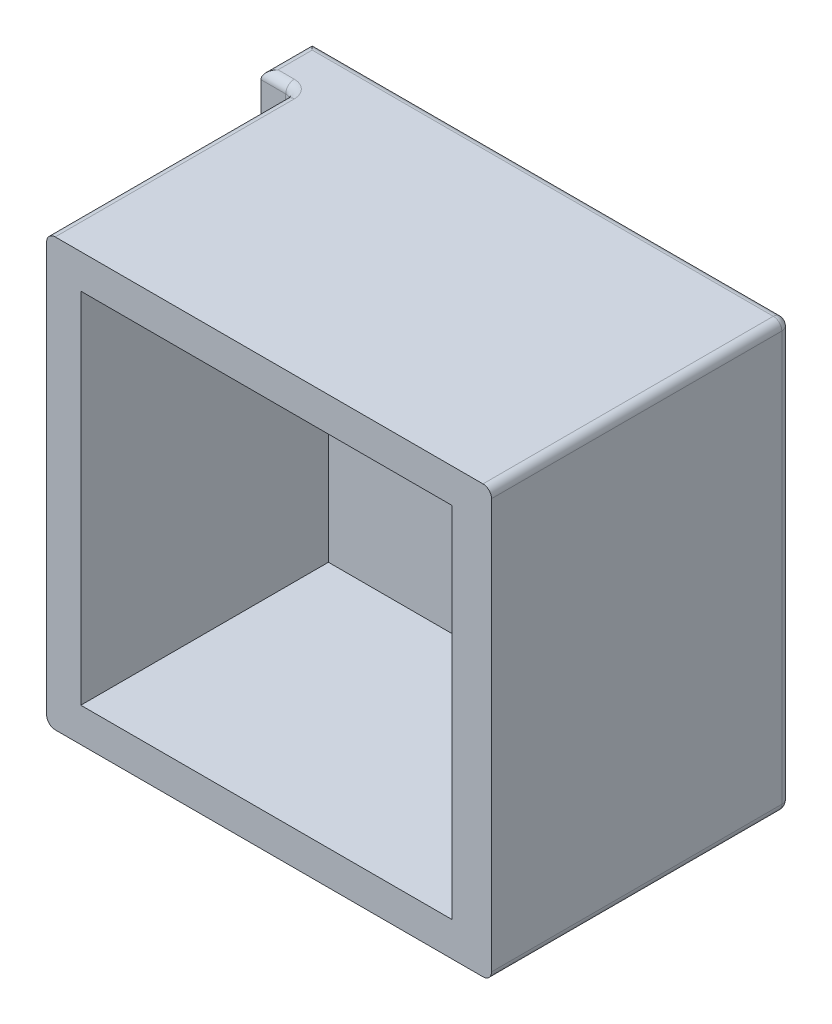
ISO-10303-21;
HEADER;
FILE_DESCRIPTION(('STEP AP214'),'2;1');
FILE_NAME('part.step','',(''),(''),'','','');
FILE_SCHEMA(('AUTOMOTIVE_DESIGN { 1 0 10303 214 1 1 1 1 }'));
ENDSEC;
DATA;
#1=APPLICATION_CONTEXT('core data for automotive mechanical design processes');
#2=APPLICATION_PROTOCOL_DEFINITION('international standard','automotive_design',2000,#1);
#3=PRODUCT_CONTEXT('',#1,'mechanical');
#4=PRODUCT('Part','Part','',(#3));
#5=PRODUCT_RELATED_PRODUCT_CATEGORY('part','',(#4));
#6=PRODUCT_DEFINITION_FORMATION('','',#4);
#7=PRODUCT_DEFINITION_CONTEXT('part definition',#1,'design');
#8=PRODUCT_DEFINITION('design','',#6,#7);
#9=PRODUCT_DEFINITION_SHAPE('','',#8);
#10=(LENGTH_UNIT() NAMED_UNIT(*) SI_UNIT(.MILLI.,.METRE.));
#11=(NAMED_UNIT(*) PLANE_ANGLE_UNIT() SI_UNIT($,.RADIAN.));
#12=(NAMED_UNIT(*) SI_UNIT($,.STERADIAN.) SOLID_ANGLE_UNIT());
#13=UNCERTAINTY_MEASURE_WITH_UNIT(LENGTH_MEASURE(1.E-05),#10,'distance_accuracy_value','');
#14=(GEOMETRIC_REPRESENTATION_CONTEXT(3) GLOBAL_UNCERTAINTY_ASSIGNED_CONTEXT((#13)) GLOBAL_UNIT_ASSIGNED_CONTEXT((#10,
#11,#12)) REPRESENTATION_CONTEXT('',''));
#15=CARTESIAN_POINT('',(0.,0.,0.));
#16=DIRECTION('',(0.,0.,1.));
#17=DIRECTION('',(1.,0.,0.));
#18=AXIS2_PLACEMENT_3D('',#15,#16,#17);
#19=CARTESIAN_POINT('',(0.,0.,6.));
#20=DIRECTION('',(0.,0.,1.));
#21=DIRECTION('',(1.,0.,0.));
#22=AXIS2_PLACEMENT_3D('',#19,#20,#21);
#23=PLANE('',#22);
#24=CARTESIAN_POINT('',(5.49163284391657,-11.0968858131488,6.));
#25=DIRECTION('',(0.,0.,1.));
#26=DIRECTION('',(1.,0.,0.));
#27=AXIS2_PLACEMENT_3D('',#24,#25,#26);
#28=CIRCLE('',#27,5.);
#29=CARTESIAN_POINT('',(10.4916328439166,-11.0968858131488,6.));
#30=VERTEX_POINT('',#29);
#31=EDGE_CURVE('E245',#30,#30,#28,.T.);
#32=ORIENTED_EDGE('',*,*,#31,.F.);
#33=EDGE_LOOP('',(#32));
#34=FACE_BOUND('',#33,.T.);
#35=DIRECTION('',(0.,1.,0.));
#36=VECTOR('',#35,1.);
#37=CARTESIAN_POINT('',(27.6816328439166,9.90311418685121,6.));
#38=LINE('',#37,#36);
#39=CARTESIAN_POINT('',(27.6816328439166,-32.0968858131488,6.));
#40=VERTEX_POINT('',#39);
#41=CARTESIAN_POINT('',(27.6816328439166,9.90311418685121,6.));
#42=VERTEX_POINT('',#41);
#43=EDGE_CURVE('E214',#40,#42,#38,.T.);
#44=ORIENTED_EDGE('',*,*,#43,.T.);
#45=DIRECTION('',(-1.,0.,0.));
#46=VECTOR('',#45,1.);
#47=CARTESIAN_POINT('',(-15.8183671560834,9.90311418685121,6.));
#48=LINE('',#47,#46);
#49=CARTESIAN_POINT('',(-15.8183671560834,9.90311418685121,6.));
#50=VERTEX_POINT('',#49);
#51=EDGE_CURVE('E186',#42,#50,#48,.T.);
#52=ORIENTED_EDGE('',*,*,#51,.T.);
#53=DIRECTION('',(0.,-1.,0.));
#54=VECTOR('',#53,1.);
#55=CARTESIAN_POINT('',(-15.8183671560834,9.90311418685121,6.));
#56=LINE('',#55,#54);
#57=CARTESIAN_POINT('',(-15.8183671560834,-32.0968858131488,6.));
#58=VERTEX_POINT('',#57);
#59=EDGE_CURVE('E209',#50,#58,#56,.T.);
#60=ORIENTED_EDGE('',*,*,#59,.T.);
#61=DIRECTION('',(1.,0.,0.));
#62=VECTOR('',#61,1.);
#63=CARTESIAN_POINT('',(-15.8183671560834,-32.0968858131488,6.));
#64=LINE('',#63,#62);
#65=EDGE_CURVE('E192',#58,#40,#64,.T.);
#66=ORIENTED_EDGE('',*,*,#65,.T.);
#67=EDGE_LOOP('',(#44,#52,#60,#66));
#68=FACE_BOUND('',#67,.T.);
#69=ADVANCED_FACE('F41',(#34,#68),#23,.T.);
#70=DIRECTION('',(0.,-1.,0.));
#71=VECTOR('',#70,1.);
#72=CARTESIAN_POINT('',(-20.8183671560834,0.,6.));
#73=LINE('',#72,#71);
#74=CARTESIAN_POINT('',(-20.8183671560834,-35.0968858131488,6.));
#75=VERTEX_POINT('',#74);
#76=CARTESIAN_POINT('',(-20.8183671560834,12.9031141868512,6.));
#77=VERTEX_POINT('',#76);
#78=EDGE_CURVE('E257',#75,#77,#73,.F.);
#79=ORIENTED_EDGE('',*,*,#78,.T.);
#80=DIRECTION('',(-1.,0.,0.));
#81=VECTOR('',#80,1.);
#82=CARTESIAN_POINT('',(-23.7183671560834,12.9031141868512,6.));
#83=LINE('',#82,#81);
#84=CARTESIAN_POINT('',(-23.7183671560834,12.9031141868512,6.));
#85=VERTEX_POINT('',#84);
#86=EDGE_CURVE('E266',#77,#85,#83,.T.);
#87=ORIENTED_EDGE('',*,*,#86,.T.);
#88=DIRECTION('',(0.,-1.,0.));
#89=VECTOR('',#88,1.);
#90=CARTESIAN_POINT('',(-23.7183671560834,13.9031141868512,6.));
#91=LINE('',#90,#89);
#92=CARTESIAN_POINT('',(-23.7183671560834,-35.0968858131488,6.));
#93=VERTEX_POINT('',#92);
#94=EDGE_CURVE('E253',#85,#93,#91,.T.);
#95=ORIENTED_EDGE('',*,*,#94,.T.);
#96=DIRECTION('',(1.,0.,0.));
#97=VECTOR('',#96,1.);
#98=CARTESIAN_POINT('',(-19.8183671560834,-35.0968858131488,6.));
#99=LINE('',#98,#97);
#100=EDGE_CURVE('E263',#93,#75,#99,.T.);
#101=ORIENTED_EDGE('',*,*,#100,.T.);
#102=EDGE_LOOP('',(#79,#87,#95,#101));
#103=FACE_BOUND('',#102,.T.);
#104=ADVANCED_FACE('F483',(#103),#23,.T.);
#105=CARTESIAN_POINT('',(0.,0.,0.));
#106=DIRECTION('',(0.,0.,1.));
#107=DIRECTION('',(1.,0.,0.));
#108=AXIS2_PLACEMENT_3D('',#105,#106,#107);
#109=PLANE('',#108);
#110=DIRECTION('',(0.,1.,0.));
#111=VECTOR('',#110,1.);
#112=CARTESIAN_POINT('',(31.2816328439166,0.,0.));
#113=LINE('',#112,#111);
#114=CARTESIAN_POINT('',(31.2816328439166,12.9031141868512,0.));
#115=VERTEX_POINT('',#114);
#116=CARTESIAN_POINT('',(31.2816328439166,-35.0968858131488,0.));
#117=VERTEX_POINT('',#116);
#118=EDGE_CURVE('E309',#115,#117,#113,.F.);
#119=ORIENTED_EDGE('',*,*,#118,.T.);
#120=DIRECTION('',(1.,0.,0.));
#121=VECTOR('',#120,1.);
#122=CARTESIAN_POINT('',(0.,-35.0968858131488,0.));
#123=LINE('',#122,#121);
#124=CARTESIAN_POINT('',(-23.7183671560834,-35.0968858131488,0.));
#125=VERTEX_POINT('',#124);
#126=EDGE_CURVE('E315',#117,#125,#123,.F.);
#127=ORIENTED_EDGE('',*,*,#126,.T.);
#128=DIRECTION('',(0.,-1.,0.));
#129=VECTOR('',#128,1.);
#130=CARTESIAN_POINT('',(-23.7183671560834,13.9031141868512,0.));
#131=LINE('',#130,#129);
#132=CARTESIAN_POINT('',(-23.7183671560834,12.9031141868512,0.));
#133=VERTEX_POINT('',#132);
#134=EDGE_CURVE('E249',#133,#125,#131,.T.);
#135=ORIENTED_EDGE('',*,*,#134,.F.);
#136=DIRECTION('',(-1.,0.,0.));
#137=VECTOR('',#136,1.);
#138=CARTESIAN_POINT('',(0.,12.9031141868512,0.));
#139=LINE('',#138,#137);
#140=EDGE_CURVE('E312',#133,#115,#139,.F.);
#141=ORIENTED_EDGE('',*,*,#140,.T.);
#142=EDGE_LOOP('',(#119,#127,#135,#141));
#143=FACE_BOUND('',#142,.T.);
#144=CARTESIAN_POINT('',(5.49163284391657,-11.0968858131488,0.));
#145=DIRECTION('',(0.,0.,1.));
#146=DIRECTION('',(1.,0.,0.));
#147=AXIS2_PLACEMENT_3D('',#144,#145,#146);
#148=CIRCLE('',#147,5.);
#149=CARTESIAN_POINT('',(10.4916328439166,-11.0968858131488,0.));
#150=VERTEX_POINT('',#149);
#151=EDGE_CURVE('E244',#150,#150,#148,.T.);
#152=ORIENTED_EDGE('',*,*,#151,.T.);
#153=EDGE_LOOP('',(#152));
#154=FACE_BOUND('',#153,.T.);
#155=ADVANCED_FACE('F490',(#143,#154),#109,.F.);
#156=CARTESIAN_POINT('',(-23.7183671560834,13.9031141868512,6.));
#157=DIRECTION('',(1.,0.,0.));
#158=DIRECTION('',(0.,1.,0.));
#159=AXIS2_PLACEMENT_3D('',#156,#157,#158);
#160=PLANE('',#159);
#161=ORIENTED_EDGE('',*,*,#134,.T.);
#162=DIRECTION('',(0.,0.,-1.));
#163=VECTOR('',#162,1.);
#164=CARTESIAN_POINT('',(-23.7183671560834,-35.0968858131488,6.));
#165=LINE('',#164,#163);
#166=EDGE_CURVE('E330',#125,#93,#165,.F.);
#167=ORIENTED_EDGE('',*,*,#166,.T.);
#168=ORIENTED_EDGE('',*,*,#94,.F.);
#169=DIRECTION('',(0.,0.,-1.));
#170=VECTOR('',#169,1.);
#171=CARTESIAN_POINT('',(-23.7183671560834,12.9031141868512,6.));
#172=LINE('',#171,#170);
#173=EDGE_CURVE('E327',#85,#133,#172,.T.);
#174=ORIENTED_EDGE('',*,*,#173,.T.);
#175=EDGE_LOOP('',(#161,#167,#168,#174));
#176=FACE_BOUND('',#175,.T.);
#177=ADVANCED_FACE('F486',(#176),#160,.F.);
#178=CARTESIAN_POINT('',(-23.7183671560834,-36.0968858131488,6.));
#179=DIRECTION('',(0.,1.,0.));
#180=DIRECTION('',(0.,0.,1.));
#181=AXIS2_PLACEMENT_3D('',#178,#179,#180);
#182=PLANE('',#181);
#183=DIRECTION('',(1.,0.,0.));
#184=VECTOR('',#183,1.);
#185=CARTESIAN_POINT('',(32.2816328439166,-36.0968858131488,35.));
#186=LINE('',#185,#184);
#187=CARTESIAN_POINT('',(-18.8183671560834,-36.0968858131488,35.));
#188=VERTEX_POINT('',#187);
#189=CARTESIAN_POINT('',(31.2816328439166,-36.0968858131488,35.));
#190=VERTEX_POINT('',#189);
#191=EDGE_CURVE('E236',#188,#190,#186,.T.);
#192=ORIENTED_EDGE('',*,*,#191,.F.);
#193=DIRECTION('',(0.,0.,-1.));
#194=VECTOR('',#193,1.);
#195=CARTESIAN_POINT('',(-18.8183671560834,-36.0968858131488,6.));
#196=LINE('',#195,#194);
#197=CARTESIAN_POINT('',(-18.8183671560834,-36.0968858131488,7.));
#198=VERTEX_POINT('',#197);
#199=EDGE_CURVE('E306',#188,#198,#196,.T.);
#200=ORIENTED_EDGE('',*,*,#199,.T.);
#201=CARTESIAN_POINT('',(-20.8183671560834,-36.0968858131488,7.));
#202=DIRECTION('',(0.,1.,0.));
#203=DIRECTION('',(0.,0.,1.));
#204=AXIS2_PLACEMENT_3D('',#201,#202,#203);
#205=CIRCLE('',#204,2.);
#206=CARTESIAN_POINT('',(-20.8183671560834,-36.0968858131488,5.));
#207=VERTEX_POINT('',#206);
#208=EDGE_CURVE('E302',#207,#198,#205,.F.);
#209=ORIENTED_EDGE('',*,*,#208,.F.);
#210=DIRECTION('',(1.,0.,0.));
#211=VECTOR('',#210,1.);
#212=CARTESIAN_POINT('',(-23.7183671560834,-36.0968858131488,5.));
#213=LINE('',#212,#211);
#214=CARTESIAN_POINT('',(-22.7183671560834,-36.0968858131488,5.));
#215=VERTEX_POINT('',#214);
#216=EDGE_CURVE('E299',#207,#215,#213,.F.);
#217=ORIENTED_EDGE('',*,*,#216,.T.);
#218=DIRECTION('',(0.,0.,-1.));
#219=VECTOR('',#218,1.);
#220=CARTESIAN_POINT('',(-22.7183671560834,-36.0968858131488,6.));
#221=LINE('',#220,#219);
#222=CARTESIAN_POINT('',(-22.7183671560834,-36.0968858131488,1.));
#223=VERTEX_POINT('',#222);
#224=EDGE_CURVE('E296',#215,#223,#221,.T.);
#225=ORIENTED_EDGE('',*,*,#224,.T.);
#226=DIRECTION('',(1.,0.,0.));
#227=VECTOR('',#226,1.);
#228=CARTESIAN_POINT('',(-23.7183671560834,-36.0968858131488,1.));
#229=LINE('',#228,#227);
#230=CARTESIAN_POINT('',(31.2816328439166,-36.0968858131488,1.));
#231=VERTEX_POINT('',#230);
#232=EDGE_CURVE('E293',#223,#231,#229,.T.);
#233=ORIENTED_EDGE('',*,*,#232,.T.);
#234=DIRECTION('',(0.,0.,-1.));
#235=VECTOR('',#234,1.);
#236=CARTESIAN_POINT('',(31.2816328439166,-36.0968858131488,6.));
#237=LINE('',#236,#235);
#238=EDGE_CURVE('E290',#231,#190,#237,.F.);
#239=ORIENTED_EDGE('',*,*,#238,.T.);
#240=EDGE_LOOP('',(#192,#200,#209,#217,#225,#233,#239));
#241=FACE_BOUND('',#240,.T.);
#242=ADVANCED_FACE('F421',(#241),#182,.F.);
#243=CARTESIAN_POINT('',(32.2816328439166,13.9031141868512,6.));
#244=DIRECTION('',(-1.,0.,0.));
#245=DIRECTION('',(0.,-1.,0.));
#246=AXIS2_PLACEMENT_3D('',#243,#244,#245);
#247=PLANE('',#246);
#248=DIRECTION('',(0.,1.,0.));
#249=VECTOR('',#248,1.);
#250=CARTESIAN_POINT('',(32.2816328439166,13.9031141868512,35.));
#251=LINE('',#250,#249);
#252=CARTESIAN_POINT('',(32.2816328439166,-35.0968858131488,35.));
#253=VERTEX_POINT('',#252);
#254=CARTESIAN_POINT('',(32.2816328439166,12.9031141868512,35.));
#255=VERTEX_POINT('',#254);
#256=EDGE_CURVE('E240',#253,#255,#251,.T.);
#257=ORIENTED_EDGE('',*,*,#256,.F.);
#258=DIRECTION('',(0.,0.,-1.));
#259=VECTOR('',#258,1.);
#260=CARTESIAN_POINT('',(32.2816328439166,-35.0968858131488,6.));
#261=LINE('',#260,#259);
#262=CARTESIAN_POINT('',(32.2816328439166,-35.0968858131488,1.));
#263=VERTEX_POINT('',#262);
#264=EDGE_CURVE('E324',#253,#263,#261,.T.);
#265=ORIENTED_EDGE('',*,*,#264,.T.);
#266=DIRECTION('',(0.,1.,0.));
#267=VECTOR('',#266,1.);
#268=CARTESIAN_POINT('',(32.2816328439166,13.9031141868512,1.));
#269=LINE('',#268,#267);
#270=CARTESIAN_POINT('',(32.2816328439166,12.9031141868512,1.));
#271=VERTEX_POINT('',#270);
#272=EDGE_CURVE('E321',#263,#271,#269,.T.);
#273=ORIENTED_EDGE('',*,*,#272,.T.);
#274=DIRECTION('',(0.,0.,-1.));
#275=VECTOR('',#274,1.);
#276=CARTESIAN_POINT('',(32.2816328439166,12.9031141868512,6.));
#277=LINE('',#276,#275);
#278=EDGE_CURVE('E318',#271,#255,#277,.F.);
#279=ORIENTED_EDGE('',*,*,#278,.T.);
#280=EDGE_LOOP('',(#257,#265,#273,#279));
#281=FACE_BOUND('',#280,.T.);
#282=ADVANCED_FACE('F431',(#281),#247,.F.);
#283=CARTESIAN_POINT('',(-23.7183671560834,13.9031141868512,6.));
#284=DIRECTION('',(0.,-1.,0.));
#285=DIRECTION('',(0.,0.,-1.));
#286=AXIS2_PLACEMENT_3D('',#283,#284,#285);
#287=PLANE('',#286);
#288=CARTESIAN_POINT('',(-20.8183671560834,13.9031141868512,7.));
#289=DIRECTION('',(0.,-1.,0.));
#290=DIRECTION('',(0.,0.,-1.));
#291=AXIS2_PLACEMENT_3D('',#288,#289,#290);
#292=CIRCLE('',#291,2.);
#293=CARTESIAN_POINT('',(-18.8183671560834,13.9031141868512,7.));
#294=VERTEX_POINT('',#293);
#295=CARTESIAN_POINT('',(-20.8183671560834,13.9031141868512,5.));
#296=VERTEX_POINT('',#295);
#297=EDGE_CURVE('E283',#294,#296,#292,.F.);
#298=ORIENTED_EDGE('',*,*,#297,.F.);
#299=DIRECTION('',(0.,0.,-1.));
#300=VECTOR('',#299,1.);
#301=CARTESIAN_POINT('',(-18.8183671560834,13.9031141868512,6.));
#302=LINE('',#301,#300);
#303=CARTESIAN_POINT('',(-18.8183671560834,13.9031141868512,35.));
#304=VERTEX_POINT('',#303);
#305=EDGE_CURVE('E287',#294,#304,#302,.F.);
#306=ORIENTED_EDGE('',*,*,#305,.T.);
#307=DIRECTION('',(-1.,0.,0.));
#308=VECTOR('',#307,1.);
#309=CARTESIAN_POINT('',(-19.8183671560834,13.9031141868512,35.));
#310=LINE('',#309,#308);
#311=CARTESIAN_POINT('',(31.2816328439166,13.9031141868512,35.));
#312=VERTEX_POINT('',#311);
#313=EDGE_CURVE('E194',#312,#304,#310,.T.);
#314=ORIENTED_EDGE('',*,*,#313,.F.);
#315=DIRECTION('',(0.,0.,-1.));
#316=VECTOR('',#315,1.);
#317=CARTESIAN_POINT('',(31.2816328439166,13.9031141868512,6.));
#318=LINE('',#317,#316);
#319=CARTESIAN_POINT('',(31.2816328439166,13.9031141868512,1.));
#320=VERTEX_POINT('',#319);
#321=EDGE_CURVE('E270',#312,#320,#318,.T.);
#322=ORIENTED_EDGE('',*,*,#321,.T.);
#323=DIRECTION('',(-1.,0.,0.));
#324=VECTOR('',#323,1.);
#325=CARTESIAN_POINT('',(-23.7183671560834,13.9031141868512,1.));
#326=LINE('',#325,#324);
#327=CARTESIAN_POINT('',(-22.7183671560834,13.9031141868512,1.));
#328=VERTEX_POINT('',#327);
#329=EDGE_CURVE('E273',#320,#328,#326,.T.);
#330=ORIENTED_EDGE('',*,*,#329,.T.);
#331=DIRECTION('',(0.,0.,-1.));
#332=VECTOR('',#331,1.);
#333=CARTESIAN_POINT('',(-22.7183671560834,13.9031141868512,6.));
#334=LINE('',#333,#332);
#335=CARTESIAN_POINT('',(-22.7183671560834,13.9031141868512,5.));
#336=VERTEX_POINT('',#335);
#337=EDGE_CURVE('E276',#328,#336,#334,.F.);
#338=ORIENTED_EDGE('',*,*,#337,.T.);
#339=DIRECTION('',(-1.,0.,0.));
#340=VECTOR('',#339,1.);
#341=CARTESIAN_POINT('',(-19.8183671560834,13.9031141868512,5.));
#342=LINE('',#341,#340);
#343=EDGE_CURVE('E279',#336,#296,#342,.F.);
#344=ORIENTED_EDGE('',*,*,#343,.T.);
#345=EDGE_LOOP('',(#298,#306,#314,#322,#330,#338,#344));
#346=FACE_BOUND('',#345,.T.);
#347=ADVANCED_FACE('F452',(#346),#287,.F.);
#348=CARTESIAN_POINT('',(5.49163284391657,-11.0968858131488,6.));
#349=DIRECTION('',(0.,0.,-1.));
#350=DIRECTION('',(-1.,0.,0.));
#351=AXIS2_PLACEMENT_3D('',#348,#349,#350);
#352=CYLINDRICAL_SURFACE('',#351,5.);
#353=ORIENTED_EDGE('',*,*,#31,.T.);
#354=EDGE_LOOP('',(#353));
#355=FACE_BOUND('',#354,.T.);
#356=ORIENTED_EDGE('',*,*,#151,.F.);
#357=EDGE_LOOP('',(#356));
#358=FACE_BOUND('',#357,.T.);
#359=ADVANCED_FACE('F514',(#355,#358),#352,.F.);
#360=CARTESIAN_POINT('',(0.,0.,35.));
#361=DIRECTION('',(0.,0.,-1.));
#362=DIRECTION('',(-1.,0.,0.));
#363=AXIS2_PLACEMENT_3D('',#360,#361,#362);
#364=PLANE('',#363);
#365=ORIENTED_EDGE('',*,*,#313,.T.);
#366=CARTESIAN_POINT('',(-18.8183671560834,12.9031141868512,35.));
#367=DIRECTION('',(0.,0.,-1.));
#368=DIRECTION('',(-1.,0.,0.));
#369=AXIS2_PLACEMENT_3D('',#366,#367,#368);
#370=CIRCLE('',#369,1.);
#371=CARTESIAN_POINT('',(-19.8183671560834,12.9031141868512,35.));
#372=VERTEX_POINT('',#371);
#373=EDGE_CURVE('E11',#304,#372,#370,.F.);
#374=ORIENTED_EDGE('',*,*,#373,.T.);
#375=DIRECTION('',(0.,-1.,0.));
#376=VECTOR('',#375,1.);
#377=CARTESIAN_POINT('',(-19.8183671560834,13.9031141868512,35.));
#378=LINE('',#377,#376);
#379=CARTESIAN_POINT('',(-19.8183671560834,-35.0968858131488,35.));
#380=VERTEX_POINT('',#379);
#381=EDGE_CURVE('E232',#372,#380,#378,.T.);
#382=ORIENTED_EDGE('',*,*,#381,.T.);
#383=CARTESIAN_POINT('',(-18.8183671560834,-35.0968858131488,35.));
#384=DIRECTION('',(0.,0.,-1.));
#385=DIRECTION('',(-1.,0.,0.));
#386=AXIS2_PLACEMENT_3D('',#383,#384,#385);
#387=CIRCLE('',#386,1.);
#388=EDGE_CURVE('E51',#380,#188,#387,.F.);
#389=ORIENTED_EDGE('',*,*,#388,.T.);
#390=ORIENTED_EDGE('',*,*,#191,.T.);
#391=CARTESIAN_POINT('',(31.2816328439166,-35.0968858131488,35.));
#392=DIRECTION('',(0.,0.,-1.));
#393=DIRECTION('',(-1.,0.,0.));
#394=AXIS2_PLACEMENT_3D('',#391,#392,#393);
#395=CIRCLE('',#394,1.);
#396=EDGE_CURVE('E343',#190,#253,#395,.F.);
#397=ORIENTED_EDGE('',*,*,#396,.T.);
#398=ORIENTED_EDGE('',*,*,#256,.T.);
#399=CARTESIAN_POINT('',(31.2816328439166,12.9031141868512,35.));
#400=DIRECTION('',(0.,0.,-1.));
#401=DIRECTION('',(-1.,0.,0.));
#402=AXIS2_PLACEMENT_3D('',#399,#400,#401);
#403=CIRCLE('',#402,1.);
#404=EDGE_CURVE('E340',#255,#312,#403,.F.);
#405=ORIENTED_EDGE('',*,*,#404,.T.);
#406=EDGE_LOOP('',(#365,#374,#382,#389,#390,#397,#398,#405));
#407=FACE_BOUND('',#406,.T.);
#408=DIRECTION('',(0.,-1.,0.));
#409=VECTOR('',#408,1.);
#410=CARTESIAN_POINT('',(-15.8183671560834,9.90311418685121,35.));
#411=LINE('',#410,#409);
#412=CARTESIAN_POINT('',(-15.8183671560834,9.90311418685121,35.));
#413=VERTEX_POINT('',#412);
#414=CARTESIAN_POINT('',(-15.8183671560834,-32.0968858131488,35.));
#415=VERTEX_POINT('',#414);
#416=EDGE_CURVE('E174',#413,#415,#411,.T.);
#417=ORIENTED_EDGE('',*,*,#416,.F.);
#418=DIRECTION('',(-1.,0.,0.));
#419=VECTOR('',#418,1.);
#420=CARTESIAN_POINT('',(-15.8183671560834,9.90311418685121,35.));
#421=LINE('',#420,#419);
#422=CARTESIAN_POINT('',(27.6816328439166,9.90311418685121,35.));
#423=VERTEX_POINT('',#422);
#424=EDGE_CURVE('E204',#423,#413,#421,.T.);
#425=ORIENTED_EDGE('',*,*,#424,.F.);
#426=DIRECTION('',(0.,1.,0.));
#427=VECTOR('',#426,1.);
#428=CARTESIAN_POINT('',(27.6816328439166,9.90311418685121,35.));
#429=LINE('',#428,#427);
#430=CARTESIAN_POINT('',(27.6816328439166,-32.0968858131488,35.));
#431=VERTEX_POINT('',#430);
#432=EDGE_CURVE('E200',#431,#423,#429,.T.);
#433=ORIENTED_EDGE('',*,*,#432,.F.);
#434=DIRECTION('',(1.,0.,0.));
#435=VECTOR('',#434,1.);
#436=CARTESIAN_POINT('',(-15.8183671560834,-32.0968858131488,35.));
#437=LINE('',#436,#435);
#438=EDGE_CURVE('E185',#415,#431,#437,.T.);
#439=ORIENTED_EDGE('',*,*,#438,.F.);
#440=EDGE_LOOP('',(#417,#425,#433,#439));
#441=FACE_BOUND('',#440,.T.);
#442=ADVANCED_FACE('F198',(#407,#441),#364,.F.);
#443=CARTESIAN_POINT('',(-19.8183671560834,13.9031141868512,35.));
#444=DIRECTION('',(1.,0.,0.));
#445=DIRECTION('',(0.,1.,0.));
#446=AXIS2_PLACEMENT_3D('',#443,#444,#445);
#447=PLANE('',#446);
#448=ORIENTED_EDGE('',*,*,#381,.F.);
#449=DIRECTION('',(0.,0.,-1.));
#450=VECTOR('',#449,1.);
#451=CARTESIAN_POINT('',(-19.8183671560834,12.9031141868512,35.));
#452=LINE('',#451,#450);
#453=CARTESIAN_POINT('',(-19.8183671560834,12.9031141868512,7.));
#454=VERTEX_POINT('',#453);
#455=EDGE_CURVE('E59',#372,#454,#452,.T.);
#456=ORIENTED_EDGE('',*,*,#455,.T.);
#457=DIRECTION('',(0.,-1.,0.));
#458=VECTOR('',#457,1.);
#459=CARTESIAN_POINT('',(-19.8183671560834,13.9031141868512,7.));
#460=LINE('',#459,#458);
#461=CARTESIAN_POINT('',(-19.8183671560834,-35.0968858131488,7.));
#462=VERTEX_POINT('',#461);
#463=EDGE_CURVE('E63',#454,#462,#460,.T.);
#464=ORIENTED_EDGE('',*,*,#463,.T.);
#465=DIRECTION('',(0.,0.,-1.));
#466=VECTOR('',#465,1.);
#467=CARTESIAN_POINT('',(-19.8183671560834,-35.0968858131488,35.));
#468=LINE('',#467,#466);
#469=EDGE_CURVE('E333',#462,#380,#468,.F.);
#470=ORIENTED_EDGE('',*,*,#469,.T.);
#471=EDGE_LOOP('',(#448,#456,#464,#470));
#472=FACE_BOUND('',#471,.T.);
#473=ADVANCED_FACE('F477',(#472),#447,.F.);
#474=CARTESIAN_POINT('',(-15.8183671560834,9.90311418685121,35.));
#475=DIRECTION('',(1.,0.,0.));
#476=DIRECTION('',(0.,1.,0.));
#477=AXIS2_PLACEMENT_3D('',#474,#475,#476);
#478=PLANE('',#477);
#479=ORIENTED_EDGE('',*,*,#59,.F.);
#480=DIRECTION('',(0.,0.,-1.));
#481=VECTOR('',#480,1.);
#482=CARTESIAN_POINT('',(-15.8183671560834,9.90311418685121,35.));
#483=LINE('',#482,#481);
#484=EDGE_CURVE('E180',#413,#50,#483,.T.);
#485=ORIENTED_EDGE('',*,*,#484,.F.);
#486=ORIENTED_EDGE('',*,*,#416,.T.);
#487=DIRECTION('',(0.,0.,-1.));
#488=VECTOR('',#487,1.);
#489=CARTESIAN_POINT('',(-15.8183671560834,-32.0968858131488,35.));
#490=LINE('',#489,#488);
#491=EDGE_CURVE('E177',#415,#58,#490,.T.);
#492=ORIENTED_EDGE('',*,*,#491,.T.);
#493=EDGE_LOOP('',(#479,#485,#486,#492));
#494=FACE_BOUND('',#493,.T.);
#495=ADVANCED_FACE('F176',(#494),#478,.T.);
#496=CARTESIAN_POINT('',(-15.8183671560834,-32.0968858131488,35.));
#497=DIRECTION('',(0.,1.,0.));
#498=DIRECTION('',(0.,0.,1.));
#499=AXIS2_PLACEMENT_3D('',#496,#497,#498);
#500=PLANE('',#499);
#501=ORIENTED_EDGE('',*,*,#65,.F.);
#502=ORIENTED_EDGE('',*,*,#491,.F.);
#503=ORIENTED_EDGE('',*,*,#438,.T.);
#504=DIRECTION('',(0.,0.,-1.));
#505=VECTOR('',#504,1.);
#506=CARTESIAN_POINT('',(27.6816328439166,-32.0968858131488,35.));
#507=LINE('',#506,#505);
#508=EDGE_CURVE('E195',#431,#40,#507,.T.);
#509=ORIENTED_EDGE('',*,*,#508,.T.);
#510=EDGE_LOOP('',(#501,#502,#503,#509));
#511=FACE_BOUND('',#510,.T.);
#512=ADVANCED_FACE('F189',(#511),#500,.T.);
#513=CARTESIAN_POINT('',(27.6816328439166,9.90311418685121,35.));
#514=DIRECTION('',(-1.,0.,0.));
#515=DIRECTION('',(0.,-1.,0.));
#516=AXIS2_PLACEMENT_3D('',#513,#514,#515);
#517=PLANE('',#516);
#518=ORIENTED_EDGE('',*,*,#43,.F.);
#519=ORIENTED_EDGE('',*,*,#508,.F.);
#520=ORIENTED_EDGE('',*,*,#432,.T.);
#521=DIRECTION('',(0.,0.,-1.));
#522=VECTOR('',#521,1.);
#523=CARTESIAN_POINT('',(27.6816328439166,9.90311418685121,35.));
#524=LINE('',#523,#522);
#525=EDGE_CURVE('E223',#423,#42,#524,.T.);
#526=ORIENTED_EDGE('',*,*,#525,.T.);
#527=EDGE_LOOP('',(#518,#519,#520,#526));
#528=FACE_BOUND('',#527,.T.);
#529=ADVANCED_FACE('F570',(#528),#517,.T.);
#530=CARTESIAN_POINT('',(-15.8183671560834,9.90311418685121,35.));
#531=DIRECTION('',(0.,-1.,0.));
#532=DIRECTION('',(0.,0.,-1.));
#533=AXIS2_PLACEMENT_3D('',#530,#531,#532);
#534=PLANE('',#533);
#535=ORIENTED_EDGE('',*,*,#51,.F.);
#536=ORIENTED_EDGE('',*,*,#525,.F.);
#537=ORIENTED_EDGE('',*,*,#424,.T.);
#538=ORIENTED_EDGE('',*,*,#484,.T.);
#539=EDGE_LOOP('',(#535,#536,#537,#538));
#540=FACE_BOUND('',#539,.T.);
#541=ADVANCED_FACE('F577',(#540),#534,.T.);
#542=CARTESIAN_POINT('',(-23.7183671560834,-35.0968858131488,1.));
#543=DIRECTION('',(1.,0.,0.));
#544=DIRECTION('',(0.,0.,-1.));
#545=AXIS2_PLACEMENT_3D('',#542,#543,#544);
#546=CYLINDRICAL_SURFACE('',#545,1.);
#547=CARTESIAN_POINT('',(31.2816328439166,-35.0968858131488,1.));
#548=DIRECTION('',(1.,0.,0.));
#549=DIRECTION('',(0.,0.,-1.));
#550=AXIS2_PLACEMENT_3D('',#547,#548,#549);
#551=CIRCLE('',#550,1.);
#552=EDGE_CURVE('E401',#231,#117,#551,.T.);
#553=ORIENTED_EDGE('',*,*,#552,.F.);
#554=ORIENTED_EDGE('',*,*,#232,.F.);
#555=CARTESIAN_POINT('',(-22.7183671560834,-35.0968858131488,1.));
#556=DIRECTION('',(0.707106781186547,0.,-0.707106781186547));
#557=DIRECTION('',(-0.707106781186547,0.,-0.707106781186547));
#558=AXIS2_PLACEMENT_3D('',#555,#556,#557);
#559=ELLIPSE('',#558,1.41421356237309,1.);
#560=EDGE_CURVE('E45',#125,#223,#559,.F.);
#561=ORIENTED_EDGE('',*,*,#560,.F.);
#562=ORIENTED_EDGE('',*,*,#126,.F.);
#563=EDGE_LOOP('',(#553,#554,#561,#562));
#564=FACE_BOUND('',#563,.T.);
#565=ADVANCED_FACE('F43',(#564),#546,.T.);
#566=CARTESIAN_POINT('',(31.2816328439166,-35.0968858131488,6.));
#567=DIRECTION('',(0.,0.,-1.));
#568=DIRECTION('',(-1.,0.,0.));
#569=AXIS2_PLACEMENT_3D('',#566,#567,#568);
#570=CYLINDRICAL_SURFACE('',#569,1.);
#571=ORIENTED_EDGE('',*,*,#396,.F.);
#572=ORIENTED_EDGE('',*,*,#238,.F.);
#573=CARTESIAN_POINT('',(31.2816328439166,-35.0968858131488,1.));
#574=DIRECTION('',(0.,0.,-1.));
#575=DIRECTION('',(-1.,0.,0.));
#576=AXIS2_PLACEMENT_3D('',#573,#574,#575);
#577=CIRCLE('',#576,1.);
#578=EDGE_CURVE('E398',#263,#231,#577,.T.);
#579=ORIENTED_EDGE('',*,*,#578,.F.);
#580=ORIENTED_EDGE('',*,*,#264,.F.);
#581=EDGE_LOOP('',(#571,#572,#579,#580));
#582=FACE_BOUND('',#581,.T.);
#583=ADVANCED_FACE('F425',(#582),#570,.T.);
#584=CARTESIAN_POINT('',(-22.7183671560834,-35.0968858131488,6.));
#585=DIRECTION('',(0.,0.,-1.));
#586=DIRECTION('',(-1.,0.,0.));
#587=AXIS2_PLACEMENT_3D('',#584,#585,#586);
#588=CYLINDRICAL_SURFACE('',#587,1.);
#589=ORIENTED_EDGE('',*,*,#560,.T.);
#590=ORIENTED_EDGE('',*,*,#224,.F.);
#591=CARTESIAN_POINT('',(-22.7183671560834,-35.0968858131488,5.));
#592=DIRECTION('',(-0.707106781186547,0.,-0.707106781186547));
#593=DIRECTION('',(0.707106781186547,0.,-0.707106781186547));
#594=AXIS2_PLACEMENT_3D('',#591,#592,#593);
#595=ELLIPSE('',#594,1.41421356237309,1.);
#596=EDGE_CURVE('E394',#93,#215,#595,.F.);
#597=ORIENTED_EDGE('',*,*,#596,.F.);
#598=ORIENTED_EDGE('',*,*,#166,.F.);
#599=EDGE_LOOP('',(#589,#590,#597,#598));
#600=FACE_BOUND('',#599,.T.);
#601=ADVANCED_FACE('F413',(#600),#588,.T.);
#602=CARTESIAN_POINT('',(31.2816328439166,-35.0968858131488,1.));
#603=DIRECTION('',(0.,0.,1.));
#604=DIRECTION('',(1.,0.,0.));
#605=AXIS2_PLACEMENT_3D('',#602,#603,#604);
#606=SPHERICAL_SURFACE('',#605,1.);
#607=ORIENTED_EDGE('',*,*,#578,.T.);
#608=ORIENTED_EDGE('',*,*,#552,.T.);
#609=CARTESIAN_POINT('',(31.2816328439166,-35.0968858131488,1.));
#610=DIRECTION('',(0.,-1.,0.));
#611=DIRECTION('',(0.,0.,-1.));
#612=AXIS2_PLACEMENT_3D('',#609,#610,#611);
#613=CIRCLE('',#612,1.);
#614=EDGE_CURVE('E390',#263,#117,#613,.F.);
#615=ORIENTED_EDGE('',*,*,#614,.F.);
#616=EDGE_LOOP('',(#607,#608,#615));
#617=FACE_BOUND('',#616,.T.);
#618=ADVANCED_FACE('F602',(#617),#606,.T.);
#619=CARTESIAN_POINT('',(-18.8183671560834,-35.0968858131488,6.));
#620=DIRECTION('',(0.,0.,-1.));
#621=DIRECTION('',(-1.,0.,0.));
#622=AXIS2_PLACEMENT_3D('',#619,#620,#621);
#623=CYLINDRICAL_SURFACE('',#622,1.);
#624=ORIENTED_EDGE('',*,*,#388,.F.);
#625=ORIENTED_EDGE('',*,*,#469,.F.);
#626=CARTESIAN_POINT('',(-18.8183671560834,-35.0968858131488,7.));
#627=DIRECTION('',(0.,0.,-1.));
#628=DIRECTION('',(-1.,0.,0.));
#629=AXIS2_PLACEMENT_3D('',#626,#627,#628);
#630=CIRCLE('',#629,1.);
#631=EDGE_CURVE('E386',#198,#462,#630,.T.);
#632=ORIENTED_EDGE('',*,*,#631,.F.);
#633=ORIENTED_EDGE('',*,*,#199,.F.);
#634=EDGE_LOOP('',(#624,#625,#632,#633));
#635=FACE_BOUND('',#634,.T.);
#636=ADVANCED_FACE('F476',(#635),#623,.T.);
#637=CARTESIAN_POINT('',(0.,-35.0968858131488,5.));
#638=DIRECTION('',(-1.,0.,0.));
#639=DIRECTION('',(0.,0.,1.));
#640=AXIS2_PLACEMENT_3D('',#637,#638,#639);
#641=CYLINDRICAL_SURFACE('',#640,1.);
#642=ORIENTED_EDGE('',*,*,#596,.T.);
#643=ORIENTED_EDGE('',*,*,#216,.F.);
#644=CARTESIAN_POINT('',(-20.8183671560834,-35.0968858131488,5.));
#645=DIRECTION('',(1.,0.,0.));
#646=DIRECTION('',(0.,0.,-1.));
#647=AXIS2_PLACEMENT_3D('',#644,#645,#646);
#648=CIRCLE('',#647,1.);
#649=EDGE_CURVE('E382',#75,#207,#648,.T.);
#650=ORIENTED_EDGE('',*,*,#649,.F.);
#651=ORIENTED_EDGE('',*,*,#100,.F.);
#652=EDGE_LOOP('',(#642,#643,#650,#651));
#653=FACE_BOUND('',#652,.T.);
#654=ADVANCED_FACE('F480',(#653),#641,.T.);
#655=CARTESIAN_POINT('',(31.2816328439166,13.9031141868512,1.));
#656=DIRECTION('',(0.,1.,0.));
#657=DIRECTION('',(-1.,0.,0.));
#658=AXIS2_PLACEMENT_3D('',#655,#656,#657);
#659=CYLINDRICAL_SURFACE('',#658,1.);
#660=ORIENTED_EDGE('',*,*,#614,.T.);
#661=ORIENTED_EDGE('',*,*,#118,.F.);
#662=CARTESIAN_POINT('',(31.2816328439166,12.9031141868512,1.));
#663=DIRECTION('',(0.,1.,0.));
#664=DIRECTION('',(0.,0.,1.));
#665=AXIS2_PLACEMENT_3D('',#662,#663,#664);
#666=CIRCLE('',#665,1.);
#667=EDGE_CURVE('E378',#271,#115,#666,.T.);
#668=ORIENTED_EDGE('',*,*,#667,.F.);
#669=ORIENTED_EDGE('',*,*,#272,.F.);
#670=EDGE_LOOP('',(#660,#661,#668,#669));
#671=FACE_BOUND('',#670,.T.);
#672=ADVANCED_FACE('F442',(#671),#659,.T.);
#673=CARTESIAN_POINT('',(31.2816328439166,12.9031141868512,6.));
#674=DIRECTION('',(0.,0.,-1.));
#675=DIRECTION('',(-1.,0.,0.));
#676=AXIS2_PLACEMENT_3D('',#673,#674,#675);
#677=CYLINDRICAL_SURFACE('',#676,1.);
#678=ORIENTED_EDGE('',*,*,#404,.F.);
#679=ORIENTED_EDGE('',*,*,#278,.F.);
#680=CARTESIAN_POINT('',(31.2816328439166,12.9031141868512,1.));
#681=DIRECTION('',(0.,0.,-1.));
#682=DIRECTION('',(-1.,0.,0.));
#683=AXIS2_PLACEMENT_3D('',#680,#681,#682);
#684=CIRCLE('',#683,1.);
#685=EDGE_CURVE('E374',#320,#271,#684,.T.);
#686=ORIENTED_EDGE('',*,*,#685,.F.);
#687=ORIENTED_EDGE('',*,*,#321,.F.);
#688=EDGE_LOOP('',(#678,#679,#686,#687));
#689=FACE_BOUND('',#688,.T.);
#690=ADVANCED_FACE('F437',(#689),#677,.T.);
#691=CARTESIAN_POINT('',(-20.8183671560834,-35.0968858131488,7.));
#692=DIRECTION('',(0.,1.,0.));
#693=DIRECTION('',(0.,0.,1.));
#694=AXIS2_PLACEMENT_3D('',#691,#692,#693);
#695=TOROIDAL_SURFACE('',#694,2.,1.);
#696=ORIENTED_EDGE('',*,*,#208,.T.);
#697=ORIENTED_EDGE('',*,*,#631,.T.);
#698=CARTESIAN_POINT('',(-20.8183671560834,-35.0968858131488,7.));
#699=DIRECTION('',(0.,1.,0.));
#700=DIRECTION('',(0.,0.,1.));
#701=AXIS2_PLACEMENT_3D('',#698,#699,#700);
#702=CIRCLE('',#701,1.);
#703=EDGE_CURVE('E370',#75,#462,#702,.F.);
#704=ORIENTED_EDGE('',*,*,#703,.F.);
#705=ORIENTED_EDGE('',*,*,#649,.T.);
#706=EDGE_LOOP('',(#696,#697,#704,#705));
#707=FACE_BOUND('',#706,.T.);
#708=ADVANCED_FACE('F470',(#707),#695,.T.);
#709=CARTESIAN_POINT('',(31.2816328439166,12.9031141868512,1.));
#710=DIRECTION('',(0.,0.,1.));
#711=DIRECTION('',(1.,0.,0.));
#712=AXIS2_PLACEMENT_3D('',#709,#710,#711);
#713=SPHERICAL_SURFACE('',#712,1.);
#714=ORIENTED_EDGE('',*,*,#685,.T.);
#715=ORIENTED_EDGE('',*,*,#667,.T.);
#716=CARTESIAN_POINT('',(31.2816328439166,12.9031141868512,1.));
#717=DIRECTION('',(1.,0.,0.));
#718=DIRECTION('',(0.,0.,-1.));
#719=AXIS2_PLACEMENT_3D('',#716,#717,#718);
#720=CIRCLE('',#719,1.);
#721=EDGE_CURVE('E366',#320,#115,#720,.F.);
#722=ORIENTED_EDGE('',*,*,#721,.F.);
#723=EDGE_LOOP('',(#714,#715,#722));
#724=FACE_BOUND('',#723,.T.);
#725=ADVANCED_FACE('F444',(#724),#713,.T.);
#726=CARTESIAN_POINT('',(-18.8183671560834,12.9031141868512,35.));
#727=DIRECTION('',(0.,0.,-1.));
#728=DIRECTION('',(-1.,0.,0.));
#729=AXIS2_PLACEMENT_3D('',#726,#727,#728);
#730=CYLINDRICAL_SURFACE('',#729,1.);
#731=ORIENTED_EDGE('',*,*,#373,.F.);
#732=ORIENTED_EDGE('',*,*,#305,.F.);
#733=CARTESIAN_POINT('',(-18.8183671560834,12.9031141868512,7.));
#734=DIRECTION('',(0.,0.,-1.));
#735=DIRECTION('',(-1.,0.,0.));
#736=AXIS2_PLACEMENT_3D('',#733,#734,#735);
#737=CIRCLE('',#736,1.);
#738=EDGE_CURVE('E362',#454,#294,#737,.T.);
#739=ORIENTED_EDGE('',*,*,#738,.F.);
#740=ORIENTED_EDGE('',*,*,#455,.F.);
#741=EDGE_LOOP('',(#731,#732,#739,#740));
#742=FACE_BOUND('',#741,.T.);
#743=ADVANCED_FACE('F458',(#742),#730,.T.);
#744=CARTESIAN_POINT('',(-20.8183671560834,13.9031141868512,7.));
#745=DIRECTION('',(0.,-1.,0.));
#746=DIRECTION('',(1.,0.,0.));
#747=AXIS2_PLACEMENT_3D('',#744,#745,#746);
#748=CYLINDRICAL_SURFACE('',#747,1.);
#749=ORIENTED_EDGE('',*,*,#703,.T.);
#750=ORIENTED_EDGE('',*,*,#463,.F.);
#751=CARTESIAN_POINT('',(-20.8183671560834,12.9031141868512,7.));
#752=DIRECTION('',(0.,-1.,0.));
#753=DIRECTION('',(0.,0.,-1.));
#754=AXIS2_PLACEMENT_3D('',#751,#752,#753);
#755=CIRCLE('',#754,1.);
#756=EDGE_CURVE('E358',#77,#454,#755,.T.);
#757=ORIENTED_EDGE('',*,*,#756,.F.);
#758=ORIENTED_EDGE('',*,*,#78,.F.);
#759=EDGE_LOOP('',(#749,#750,#757,#758));
#760=FACE_BOUND('',#759,.T.);
#761=ADVANCED_FACE('F467',(#760),#748,.F.);
#762=CARTESIAN_POINT('',(-23.7183671560834,12.9031141868512,1.));
#763=DIRECTION('',(-1.,0.,0.));
#764=DIRECTION('',(0.,0.,1.));
#765=AXIS2_PLACEMENT_3D('',#762,#763,#764);
#766=CYLINDRICAL_SURFACE('',#765,1.);
#767=ORIENTED_EDGE('',*,*,#721,.T.);
#768=ORIENTED_EDGE('',*,*,#140,.F.);
#769=CARTESIAN_POINT('',(-22.7183671560834,12.9031141868512,1.));
#770=DIRECTION('',(0.707106781186547,0.,-0.707106781186547));
#771=DIRECTION('',(-0.707106781186547,0.,-0.707106781186547));
#772=AXIS2_PLACEMENT_3D('',#769,#770,#771);
#773=ELLIPSE('',#772,1.41421356237309,1.);
#774=EDGE_CURVE('E354',#328,#133,#773,.F.);
#775=ORIENTED_EDGE('',*,*,#774,.F.);
#776=ORIENTED_EDGE('',*,*,#329,.F.);
#777=EDGE_LOOP('',(#767,#768,#775,#776));
#778=FACE_BOUND('',#777,.T.);
#779=ADVANCED_FACE('F449',(#778),#766,.T.);
#780=CARTESIAN_POINT('',(-20.8183671560834,12.9031141868512,7.));
#781=DIRECTION('',(0.,-1.,0.));
#782=DIRECTION('',(0.,0.,-1.));
#783=AXIS2_PLACEMENT_3D('',#780,#781,#782);
#784=TOROIDAL_SURFACE('',#783,2.,1.);
#785=ORIENTED_EDGE('',*,*,#738,.T.);
#786=ORIENTED_EDGE('',*,*,#297,.T.);
#787=CARTESIAN_POINT('',(-20.8183671560834,12.9031141868512,5.));
#788=DIRECTION('',(1.,0.,0.));
#789=DIRECTION('',(0.,0.,-1.));
#790=AXIS2_PLACEMENT_3D('',#787,#788,#789);
#791=CIRCLE('',#790,1.);
#792=EDGE_CURVE('E351',#77,#296,#791,.F.);
#793=ORIENTED_EDGE('',*,*,#792,.F.);
#794=ORIENTED_EDGE('',*,*,#756,.T.);
#795=EDGE_LOOP('',(#785,#786,#793,#794));
#796=FACE_BOUND('',#795,.T.);
#797=ADVANCED_FACE('F463',(#796),#784,.T.);
#798=CARTESIAN_POINT('',(-22.7183671560834,12.9031141868512,6.));
#799=DIRECTION('',(0.,0.,-1.));
#800=DIRECTION('',(-1.,0.,0.));
#801=AXIS2_PLACEMENT_3D('',#798,#799,#800);
#802=CYLINDRICAL_SURFACE('',#801,1.);
#803=ORIENTED_EDGE('',*,*,#774,.T.);
#804=ORIENTED_EDGE('',*,*,#173,.F.);
#805=CARTESIAN_POINT('',(-22.7183671560834,12.9031141868512,5.));
#806=DIRECTION('',(-0.707106781186547,0.,-0.707106781186547));
#807=DIRECTION('',(0.707106781186547,0.,-0.707106781186547));
#808=AXIS2_PLACEMENT_3D('',#805,#806,#807);
#809=ELLIPSE('',#808,1.41421356237309,1.);
#810=EDGE_CURVE('E348',#336,#85,#809,.F.);
#811=ORIENTED_EDGE('',*,*,#810,.F.);
#812=ORIENTED_EDGE('',*,*,#337,.F.);
#813=EDGE_LOOP('',(#803,#804,#811,#812));
#814=FACE_BOUND('',#813,.T.);
#815=ADVANCED_FACE('F493',(#814),#802,.T.);
#816=CARTESIAN_POINT('',(0.,12.9031141868512,5.));
#817=DIRECTION('',(1.,0.,0.));
#818=DIRECTION('',(0.,0.,-1.));
#819=AXIS2_PLACEMENT_3D('',#816,#817,#818);
#820=CYLINDRICAL_SURFACE('',#819,1.);
#821=ORIENTED_EDGE('',*,*,#792,.T.);
#822=ORIENTED_EDGE('',*,*,#343,.F.);
#823=ORIENTED_EDGE('',*,*,#810,.T.);
#824=ORIENTED_EDGE('',*,*,#86,.F.);
#825=EDGE_LOOP('',(#821,#822,#823,#824));
#826=FACE_BOUND('',#825,.T.);
#827=ADVANCED_FACE('F496',(#826),#820,.T.);
#828=CLOSED_SHELL('',(#69,#104,#155,#177,#242,#282,#347,#359,#442,#473,#495,#512,#529,#541,#565,
#583,#601,#618,#636,#654,#672,#690,#708,#725,#743,#761,#779,#797,#815,#827));
#829=MANIFOLD_SOLID_BREP('B2',#828);
#830=ADVANCED_BREP_SHAPE_REPRESENTATION('',(#18,#829),#14);
#831=SHAPE_DEFINITION_REPRESENTATION(#9,#830);
ENDSEC;
END-ISO-10303-21;
